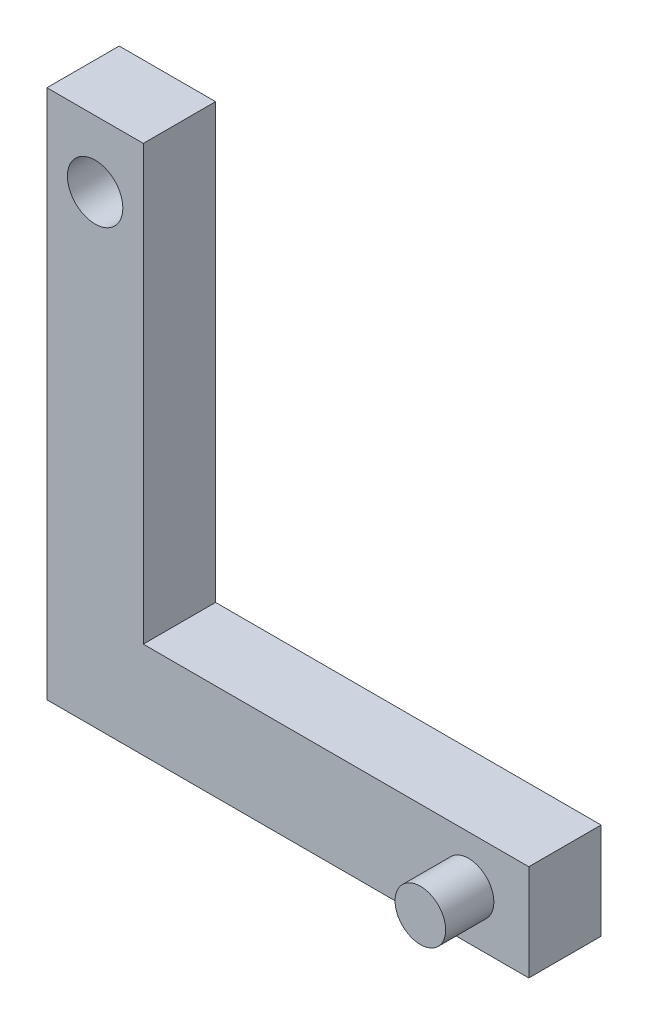
ISO-10303-21;
HEADER;
FILE_DESCRIPTION(('STEP AP214'),'2;1');
FILE_NAME('part.step','',(''),(''),'','','');
FILE_SCHEMA(('AUTOMOTIVE_DESIGN { 1 0 10303 214 1 1 1 1 }'));
ENDSEC;
DATA;
#1=APPLICATION_CONTEXT('core data for automotive mechanical design processes');
#2=APPLICATION_PROTOCOL_DEFINITION('international standard','automotive_design',2000,#1);
#3=PRODUCT_CONTEXT('',#1,'mechanical');
#4=PRODUCT('Part','Part','',(#3));
#5=PRODUCT_RELATED_PRODUCT_CATEGORY('part','',(#4));
#6=PRODUCT_DEFINITION_FORMATION('','',#4);
#7=PRODUCT_DEFINITION_CONTEXT('part definition',#1,'design');
#8=PRODUCT_DEFINITION('design','',#6,#7);
#9=PRODUCT_DEFINITION_SHAPE('','',#8);
#10=(LENGTH_UNIT() NAMED_UNIT(*) SI_UNIT(.MILLI.,.METRE.));
#11=(NAMED_UNIT(*) PLANE_ANGLE_UNIT() SI_UNIT($,.RADIAN.));
#12=(NAMED_UNIT(*) SI_UNIT($,.STERADIAN.) SOLID_ANGLE_UNIT());
#13=UNCERTAINTY_MEASURE_WITH_UNIT(LENGTH_MEASURE(1.E-05),#10,'distance_accuracy_value','');
#14=(GEOMETRIC_REPRESENTATION_CONTEXT(3) GLOBAL_UNCERTAINTY_ASSIGNED_CONTEXT((#13)) GLOBAL_UNIT_ASSIGNED_CONTEXT((#10,
#11,#12)) REPRESENTATION_CONTEXT('',''));
#15=CARTESIAN_POINT('',(0.,0.,0.));
#16=DIRECTION('',(0.,0.,1.));
#17=DIRECTION('',(1.,0.,0.));
#18=AXIS2_PLACEMENT_3D('',#15,#16,#17);
#19=CARTESIAN_POINT('',(0.,0.,3.));
#20=DIRECTION('',(0.,1.,0.));
#21=DIRECTION('',(0.,0.,1.));
#22=AXIS2_PLACEMENT_3D('',#19,#20,#21);
#23=PLANE('',#22);
#24=DIRECTION('',(1.,0.,0.));
#25=VECTOR('',#24,1.);
#26=CARTESIAN_POINT('',(0.,0.,0.));
#27=LINE('',#26,#25);
#28=CARTESIAN_POINT('',(4.,0.,0.));
#29=VERTEX_POINT('',#28);
#30=CARTESIAN_POINT('',(20.,0.,0.));
#31=VERTEX_POINT('',#30);
#32=EDGE_CURVE('E81',#29,#31,#27,.T.);
#33=ORIENTED_EDGE('',*,*,#32,.F.);
#34=DIRECTION('',(0.,0.,1.));
#35=VECTOR('',#34,1.);
#36=CARTESIAN_POINT('',(4.,0.,0.));
#37=LINE('',#36,#35);
#38=CARTESIAN_POINT('',(4.,0.,3.));
#39=VERTEX_POINT('',#38);
#40=EDGE_CURVE('E101',#29,#39,#37,.T.);
#41=ORIENTED_EDGE('',*,*,#40,.T.);
#42=DIRECTION('',(1.,0.,0.));
#43=VECTOR('',#42,1.);
#44=CARTESIAN_POINT('',(0.,0.,3.));
#45=LINE('',#44,#43);
#46=CARTESIAN_POINT('',(20.,0.,3.));
#47=VERTEX_POINT('',#46);
#48=EDGE_CURVE('E62',#39,#47,#45,.T.);
#49=ORIENTED_EDGE('',*,*,#48,.T.);
#50=DIRECTION('',(0.,0.,-1.));
#51=VECTOR('',#50,1.);
#52=CARTESIAN_POINT('',(20.,0.,3.));
#53=LINE('',#52,#51);
#54=EDGE_CURVE('E112',#47,#31,#53,.T.);
#55=ORIENTED_EDGE('',*,*,#54,.T.);
#56=EDGE_LOOP('',(#33,#41,#49,#55));
#57=FACE_BOUND('',#56,.T.);
#58=ADVANCED_FACE('F38',(#57),#23,.T.);
#59=CARTESIAN_POINT('',(0.,0.,3.));
#60=DIRECTION('',(1.,0.,0.));
#61=DIRECTION('',(0.,1.,0.));
#62=AXIS2_PLACEMENT_3D('',#59,#60,#61);
#63=PLANE('',#62);
#64=DIRECTION('',(0.,-1.,0.));
#65=VECTOR('',#64,1.);
#66=CARTESIAN_POINT('',(0.,0.,0.));
#67=LINE('',#66,#65);
#68=CARTESIAN_POINT('',(0.,18.,0.));
#69=VERTEX_POINT('',#68);
#70=CARTESIAN_POINT('',(0.,-4.,0.));
#71=VERTEX_POINT('',#70);
#72=EDGE_CURVE('E131',#69,#71,#67,.T.);
#73=ORIENTED_EDGE('',*,*,#72,.T.);
#74=DIRECTION('',(0.,0.,-1.));
#75=VECTOR('',#74,1.);
#76=CARTESIAN_POINT('',(0.,-4.,3.));
#77=LINE('',#76,#75);
#78=CARTESIAN_POINT('',(0.,-4.,3.));
#79=VERTEX_POINT('',#78);
#80=EDGE_CURVE('E42',#79,#71,#77,.T.);
#81=ORIENTED_EDGE('',*,*,#80,.F.);
#82=DIRECTION('',(0.,-1.,0.));
#83=VECTOR('',#82,1.);
#84=CARTESIAN_POINT('',(0.,0.,3.));
#85=LINE('',#84,#83);
#86=CARTESIAN_POINT('',(0.,18.,3.));
#87=VERTEX_POINT('',#86);
#88=EDGE_CURVE('E114',#87,#79,#85,.T.);
#89=ORIENTED_EDGE('',*,*,#88,.F.);
#90=DIRECTION('',(0.,0.,1.));
#91=VECTOR('',#90,1.);
#92=CARTESIAN_POINT('',(0.,18.,0.));
#93=LINE('',#92,#91);
#94=EDGE_CURVE('E133',#69,#87,#93,.T.);
#95=ORIENTED_EDGE('',*,*,#94,.F.);
#96=EDGE_LOOP('',(#73,#81,#89,#95));
#97=FACE_BOUND('',#96,.T.);
#98=ADVANCED_FACE('F40',(#97),#63,.F.);
#99=CARTESIAN_POINT('',(0.,-4.,3.));
#100=DIRECTION('',(0.,1.,0.));
#101=DIRECTION('',(0.,0.,1.));
#102=AXIS2_PLACEMENT_3D('',#99,#100,#101);
#103=PLANE('',#102);
#104=DIRECTION('',(1.,0.,0.));
#105=VECTOR('',#104,1.);
#106=CARTESIAN_POINT('',(0.,-4.,0.));
#107=LINE('',#106,#105);
#108=CARTESIAN_POINT('',(20.,-4.,0.));
#109=VERTEX_POINT('',#108);
#110=EDGE_CURVE('E118',#71,#109,#107,.T.);
#111=ORIENTED_EDGE('',*,*,#110,.T.);
#112=DIRECTION('',(0.,0.,-1.));
#113=VECTOR('',#112,1.);
#114=CARTESIAN_POINT('',(20.,-4.,3.));
#115=LINE('',#114,#113);
#116=CARTESIAN_POINT('',(20.,-4.,3.));
#117=VERTEX_POINT('',#116);
#118=EDGE_CURVE('E122',#117,#109,#115,.T.);
#119=ORIENTED_EDGE('',*,*,#118,.F.);
#120=DIRECTION('',(1.,0.,0.));
#121=VECTOR('',#120,1.);
#122=CARTESIAN_POINT('',(0.,-4.,3.));
#123=LINE('',#122,#121);
#124=EDGE_CURVE('E86',#79,#117,#123,.T.);
#125=ORIENTED_EDGE('',*,*,#124,.F.);
#126=ORIENTED_EDGE('',*,*,#80,.T.);
#127=EDGE_LOOP('',(#111,#119,#125,#126));
#128=FACE_BOUND('',#127,.T.);
#129=ADVANCED_FACE('F128',(#128),#103,.F.);
#130=CARTESIAN_POINT('',(20.,0.,3.));
#131=DIRECTION('',(1.,0.,0.));
#132=DIRECTION('',(0.,0.,-1.));
#133=AXIS2_PLACEMENT_3D('',#130,#131,#132);
#134=PLANE('',#133);
#135=DIRECTION('',(0.,-1.,0.));
#136=VECTOR('',#135,1.);
#137=CARTESIAN_POINT('',(20.,0.,0.));
#138=LINE('',#137,#136);
#139=EDGE_CURVE('E115',#31,#109,#138,.T.);
#140=ORIENTED_EDGE('',*,*,#139,.F.);
#141=ORIENTED_EDGE('',*,*,#54,.F.);
#142=DIRECTION('',(0.,-1.,0.));
#143=VECTOR('',#142,1.);
#144=CARTESIAN_POINT('',(20.,0.,3.));
#145=LINE('',#144,#143);
#146=EDGE_CURVE('E138',#47,#117,#145,.T.);
#147=ORIENTED_EDGE('',*,*,#146,.T.);
#148=ORIENTED_EDGE('',*,*,#118,.T.);
#149=EDGE_LOOP('',(#140,#141,#147,#148));
#150=FACE_BOUND('',#149,.T.);
#151=ADVANCED_FACE('F175',(#150),#134,.T.);
#152=CARTESIAN_POINT('',(0.,0.,3.));
#153=DIRECTION('',(0.,0.,1.));
#154=DIRECTION('',(1.,0.,0.));
#155=AXIS2_PLACEMENT_3D('',#152,#153,#154);
#156=PLANE('',#155);
#157=CARTESIAN_POINT('',(17.5,-2.,3.));
#158=DIRECTION('',(0.,0.,1.));
#159=DIRECTION('',(1.,0.,0.));
#160=AXIS2_PLACEMENT_3D('',#157,#158,#159);
#161=CIRCLE('',#160,1.05);
#162=CARTESIAN_POINT('',(18.55,-2.,3.));
#163=VERTEX_POINT('',#162);
#164=EDGE_CURVE('E11',#163,#163,#161,.T.);
#165=ORIENTED_EDGE('',*,*,#164,.F.);
#166=EDGE_LOOP('',(#165));
#167=FACE_BOUND('',#166,.T.);
#168=CARTESIAN_POINT('',(2.,15.25,3.));
#169=DIRECTION('',(0.,0.,1.));
#170=DIRECTION('',(1.,0.,0.));
#171=AXIS2_PLACEMENT_3D('',#168,#169,#170);
#172=CIRCLE('',#171,1.15);
#173=CARTESIAN_POINT('',(3.15,15.25,3.));
#174=VERTEX_POINT('',#173);
#175=EDGE_CURVE('E147',#174,#174,#172,.T.);
#176=ORIENTED_EDGE('',*,*,#175,.F.);
#177=EDGE_LOOP('',(#176));
#178=FACE_BOUND('',#177,.T.);
#179=ORIENTED_EDGE('',*,*,#88,.T.);
#180=ORIENTED_EDGE('',*,*,#124,.T.);
#181=ORIENTED_EDGE('',*,*,#146,.F.);
#182=ORIENTED_EDGE('',*,*,#48,.F.);
#183=DIRECTION('',(0.,1.,0.));
#184=VECTOR('',#183,1.);
#185=CARTESIAN_POINT('',(4.,0.,3.));
#186=LINE('',#185,#184);
#187=CARTESIAN_POINT('',(4.,18.,3.));
#188=VERTEX_POINT('',#187);
#189=EDGE_CURVE('E54',#39,#188,#186,.T.);
#190=ORIENTED_EDGE('',*,*,#189,.T.);
#191=DIRECTION('',(1.,0.,0.));
#192=VECTOR('',#191,1.);
#193=CARTESIAN_POINT('',(0.,18.,3.));
#194=LINE('',#193,#192);
#195=EDGE_CURVE('E110',#87,#188,#194,.T.);
#196=ORIENTED_EDGE('',*,*,#195,.F.);
#197=EDGE_LOOP('',(#179,#180,#181,#182,#190,#196));
#198=FACE_BOUND('',#197,.T.);
#199=ADVANCED_FACE('F177',(#167,#178,#198),#156,.T.);
#200=CARTESIAN_POINT('',(0.,0.,0.));
#201=DIRECTION('',(0.,0.,1.));
#202=DIRECTION('',(1.,0.,0.));
#203=AXIS2_PLACEMENT_3D('',#200,#201,#202);
#204=PLANE('',#203);
#205=CARTESIAN_POINT('',(2.,15.25,0.));
#206=DIRECTION('',(0.,0.,1.));
#207=DIRECTION('',(1.,0.,0.));
#208=AXIS2_PLACEMENT_3D('',#205,#206,#207);
#209=CIRCLE('',#208,1.15);
#210=CARTESIAN_POINT('',(3.15,15.25,0.));
#211=VERTEX_POINT('',#210);
#212=EDGE_CURVE('E145',#211,#211,#209,.T.);
#213=ORIENTED_EDGE('',*,*,#212,.T.);
#214=EDGE_LOOP('',(#213));
#215=FACE_BOUND('',#214,.T.);
#216=ORIENTED_EDGE('',*,*,#72,.F.);
#217=DIRECTION('',(1.,0.,0.));
#218=VECTOR('',#217,1.);
#219=CARTESIAN_POINT('',(0.,18.,0.));
#220=LINE('',#219,#218);
#221=CARTESIAN_POINT('',(4.,18.,0.));
#222=VERTEX_POINT('',#221);
#223=EDGE_CURVE('E105',#69,#222,#220,.T.);
#224=ORIENTED_EDGE('',*,*,#223,.T.);
#225=DIRECTION('',(0.,1.,0.));
#226=VECTOR('',#225,1.);
#227=CARTESIAN_POINT('',(4.,0.,0.));
#228=LINE('',#227,#226);
#229=EDGE_CURVE('E103',#29,#222,#228,.T.);
#230=ORIENTED_EDGE('',*,*,#229,.F.);
#231=ORIENTED_EDGE('',*,*,#32,.T.);
#232=ORIENTED_EDGE('',*,*,#139,.T.);
#233=ORIENTED_EDGE('',*,*,#110,.F.);
#234=EDGE_LOOP('',(#216,#224,#230,#231,#232,#233));
#235=FACE_BOUND('',#234,.T.);
#236=ADVANCED_FACE('F107',(#215,#235),#204,.F.);
#237=CARTESIAN_POINT('',(0.,18.,0.));
#238=DIRECTION('',(0.,-1.,0.));
#239=DIRECTION('',(0.,0.,-1.));
#240=AXIS2_PLACEMENT_3D('',#237,#238,#239);
#241=PLANE('',#240);
#242=ORIENTED_EDGE('',*,*,#195,.T.);
#243=DIRECTION('',(0.,0.,1.));
#244=VECTOR('',#243,1.);
#245=CARTESIAN_POINT('',(4.,18.,0.));
#246=LINE('',#245,#244);
#247=EDGE_CURVE('E104',#222,#188,#246,.T.);
#248=ORIENTED_EDGE('',*,*,#247,.F.);
#249=ORIENTED_EDGE('',*,*,#223,.F.);
#250=ORIENTED_EDGE('',*,*,#94,.T.);
#251=EDGE_LOOP('',(#242,#248,#249,#250));
#252=FACE_BOUND('',#251,.T.);
#253=ADVANCED_FACE('F200',(#252),#241,.F.);
#254=CARTESIAN_POINT('',(4.,0.,0.));
#255=DIRECTION('',(1.,0.,0.));
#256=DIRECTION('',(0.,0.,-1.));
#257=AXIS2_PLACEMENT_3D('',#254,#255,#256);
#258=PLANE('',#257);
#259=ORIENTED_EDGE('',*,*,#189,.F.);
#260=ORIENTED_EDGE('',*,*,#40,.F.);
#261=ORIENTED_EDGE('',*,*,#229,.T.);
#262=ORIENTED_EDGE('',*,*,#247,.T.);
#263=EDGE_LOOP('',(#259,#260,#261,#262));
#264=FACE_BOUND('',#263,.T.);
#265=ADVANCED_FACE('F102',(#264),#258,.T.);
#266=CARTESIAN_POINT('',(2.,15.25,0.));
#267=DIRECTION('',(0.,0.,1.));
#268=DIRECTION('',(1.,0.,0.));
#269=AXIS2_PLACEMENT_3D('',#266,#267,#268);
#270=CYLINDRICAL_SURFACE('',#269,1.15);
#271=ORIENTED_EDGE('',*,*,#212,.F.);
#272=EDGE_LOOP('',(#271));
#273=FACE_BOUND('',#272,.T.);
#274=ORIENTED_EDGE('',*,*,#175,.T.);
#275=EDGE_LOOP('',(#274));
#276=FACE_BOUND('',#275,.T.);
#277=ADVANCED_FACE('F164',(#273,#276),#270,.F.);
#278=CARTESIAN_POINT('',(17.5,-2.,5.));
#279=DIRECTION('',(0.,0.,-1.));
#280=DIRECTION('',(-1.,0.,0.));
#281=AXIS2_PLACEMENT_3D('',#278,#279,#280);
#282=CYLINDRICAL_SURFACE('',#281,1.05);
#283=ORIENTED_EDGE('',*,*,#164,.T.);
#284=EDGE_LOOP('',(#283));
#285=FACE_BOUND('',#284,.T.);
#286=CARTESIAN_POINT('',(17.5,-2.,5.));
#287=DIRECTION('',(0.,0.,-1.));
#288=DIRECTION('',(-1.,0.,0.));
#289=AXIS2_PLACEMENT_3D('',#286,#287,#288);
#290=CIRCLE('',#289,1.05);
#291=CARTESIAN_POINT('',(16.45,-2.,5.));
#292=VERTEX_POINT('',#291);
#293=EDGE_CURVE('E150',#292,#292,#290,.T.);
#294=ORIENTED_EDGE('',*,*,#293,.T.);
#295=EDGE_LOOP('',(#294));
#296=FACE_BOUND('',#295,.T.);
#297=ADVANCED_FACE('F156',(#285,#296),#282,.T.);
#298=CARTESIAN_POINT('',(17.5,-2.,5.));
#299=DIRECTION('',(0.,0.,-1.));
#300=DIRECTION('',(-1.,0.,0.));
#301=AXIS2_PLACEMENT_3D('',#298,#299,#300);
#302=PLANE('',#301);
#303=ORIENTED_EDGE('',*,*,#293,.F.);
#304=EDGE_LOOP('',(#303));
#305=FACE_BOUND('',#304,.T.);
#306=ADVANCED_FACE('F158',(#305),#302,.F.);
#307=CLOSED_SHELL('',(#58,#98,#129,#151,#199,#236,#253,#265,#277,#297,#306));
#308=MANIFOLD_SOLID_BREP('B2',#307);
#309=ADVANCED_BREP_SHAPE_REPRESENTATION('',(#18,#308),#14);
#310=SHAPE_DEFINITION_REPRESENTATION(#9,#309);
ENDSEC;
END-ISO-10303-21;
